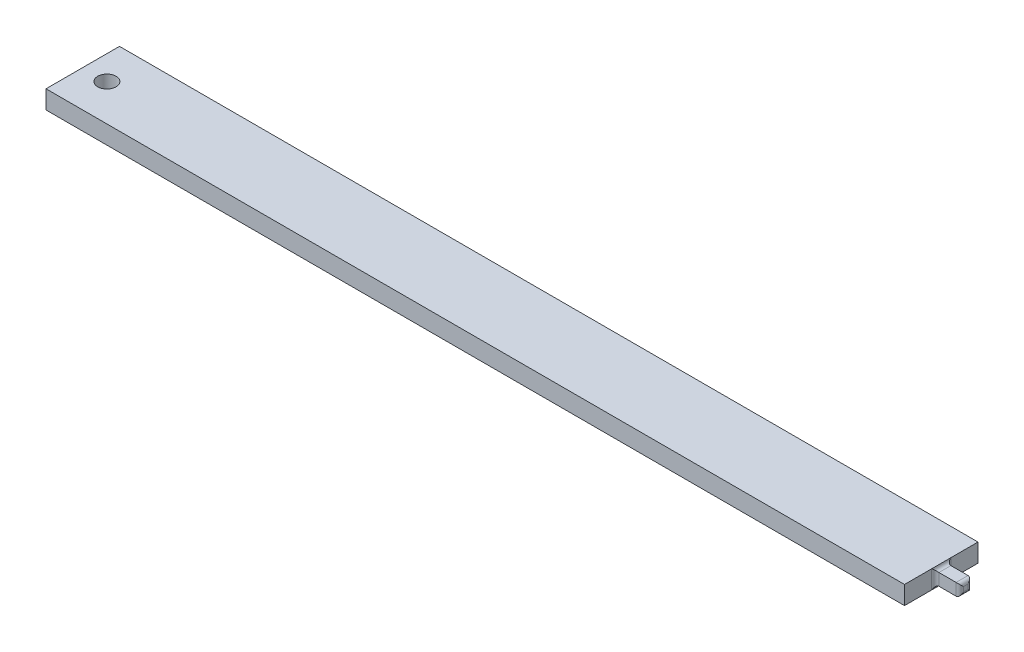
ISO-10303-21;
HEADER;
FILE_DESCRIPTION(('STEP AP214'),'2;1');
FILE_NAME('part.step','',(''),(''),'','','');
FILE_SCHEMA(('AUTOMOTIVE_DESIGN { 1 0 10303 214 1 1 1 1 }'));
ENDSEC;
DATA;
#1=APPLICATION_CONTEXT('core data for automotive mechanical design processes');
#2=APPLICATION_PROTOCOL_DEFINITION('international standard','automotive_design',2000,#1);
#3=PRODUCT_CONTEXT('',#1,'mechanical');
#4=PRODUCT('Part','Part','',(#3));
#5=PRODUCT_RELATED_PRODUCT_CATEGORY('part','',(#4));
#6=PRODUCT_DEFINITION_FORMATION('','',#4);
#7=PRODUCT_DEFINITION_CONTEXT('part definition',#1,'design');
#8=PRODUCT_DEFINITION('design','',#6,#7);
#9=PRODUCT_DEFINITION_SHAPE('','',#8);
#10=(LENGTH_UNIT() NAMED_UNIT(*) SI_UNIT(.MILLI.,.METRE.));
#11=(NAMED_UNIT(*) PLANE_ANGLE_UNIT() SI_UNIT($,.RADIAN.));
#12=(NAMED_UNIT(*) SI_UNIT($,.STERADIAN.) SOLID_ANGLE_UNIT());
#13=UNCERTAINTY_MEASURE_WITH_UNIT(LENGTH_MEASURE(1.E-05),#10,'distance_accuracy_value','');
#14=(GEOMETRIC_REPRESENTATION_CONTEXT(3) GLOBAL_UNCERTAINTY_ASSIGNED_CONTEXT((#13)) GLOBAL_UNIT_ASSIGNED_CONTEXT((#10,
#11,#12)) REPRESENTATION_CONTEXT('',''));
#15=CARTESIAN_POINT('',(0.,0.,0.));
#16=DIRECTION('',(0.,0.,1.));
#17=DIRECTION('',(1.,0.,0.));
#18=AXIS2_PLACEMENT_3D('',#15,#16,#17);
#19=CARTESIAN_POINT('',(0.,0.,6.));
#20=DIRECTION('',(-1.,0.,0.));
#21=DIRECTION('',(0.,0.,1.));
#22=AXIS2_PLACEMENT_3D('',#19,#20,#21);
#23=PLANE('',#22);
#24=DIRECTION('',(0.,0.,1.));
#25=VECTOR('',#24,1.);
#26=CARTESIAN_POINT('',(0.,3.,6.));
#27=LINE('',#26,#25);
#28=CARTESIAN_POINT('',(0.,3.,-6.));
#29=VERTEX_POINT('',#28);
#30=CARTESIAN_POINT('',(0.,3.,-1.575));
#31=VERTEX_POINT('',#30);
#32=EDGE_CURVE('E446',#29,#31,#27,.T.);
#33=ORIENTED_EDGE('',*,*,#32,.T.);
#34=DIRECTION('',(0.,1.,0.));
#35=VECTOR('',#34,1.);
#36=CARTESIAN_POINT('',(0.,0.525,-1.575));
#37=LINE('',#36,#35);
#38=CARTESIAN_POINT('',(0.,0.,-1.575));
#39=VERTEX_POINT('',#38);
#40=EDGE_CURVE('E164',#31,#39,#37,.F.);
#41=ORIENTED_EDGE('',*,*,#40,.T.);
#42=DIRECTION('',(0.,0.,1.));
#43=VECTOR('',#42,1.);
#44=CARTESIAN_POINT('',(0.,0.,6.));
#45=LINE('',#44,#43);
#46=CARTESIAN_POINT('',(0.,0.,-6.));
#47=VERTEX_POINT('',#46);
#48=EDGE_CURVE('E158',#47,#39,#45,.T.);
#49=ORIENTED_EDGE('',*,*,#48,.F.);
#50=DIRECTION('',(0.,1.,0.));
#51=VECTOR('',#50,1.);
#52=CARTESIAN_POINT('',(0.,0.,-6.));
#53=LINE('',#52,#51);
#54=EDGE_CURVE('E162',#47,#29,#53,.T.);
#55=ORIENTED_EDGE('',*,*,#54,.T.);
#56=EDGE_LOOP('',(#33,#41,#49,#55));
#57=FACE_BOUND('',#56,.T.);
#58=ADVANCED_FACE('F39',(#57),#23,.F.);
#59=CARTESIAN_POINT('',(0.,0.,1.575));
#60=VERTEX_POINT('',#59);
#61=CARTESIAN_POINT('',(0.,0.,6.));
#62=VERTEX_POINT('',#61);
#63=EDGE_CURVE('E175',#60,#62,#45,.T.);
#64=ORIENTED_EDGE('',*,*,#63,.F.);
#65=DIRECTION('',(0.,-1.,0.));
#66=VECTOR('',#65,1.);
#67=CARTESIAN_POINT('',(0.,2.475,1.575));
#68=LINE('',#67,#66);
#69=CARTESIAN_POINT('',(0.,3.,1.575));
#70=VERTEX_POINT('',#69);
#71=EDGE_CURVE('E229',#60,#70,#68,.F.);
#72=ORIENTED_EDGE('',*,*,#71,.T.);
#73=CARTESIAN_POINT('',(0.,3.,6.));
#74=VERTEX_POINT('',#73);
#75=EDGE_CURVE('E452',#70,#74,#27,.T.);
#76=ORIENTED_EDGE('',*,*,#75,.T.);
#77=DIRECTION('',(0.,1.,0.));
#78=VECTOR('',#77,1.);
#79=CARTESIAN_POINT('',(0.,0.,6.));
#80=LINE('',#79,#78);
#81=EDGE_CURVE('E169',#62,#74,#80,.T.);
#82=ORIENTED_EDGE('',*,*,#81,.F.);
#83=EDGE_LOOP('',(#64,#72,#76,#82));
#84=FACE_BOUND('',#83,.T.);
#85=ADVANCED_FACE('F263',(#84),#23,.F.);
#86=CARTESIAN_POINT('',(-140.2,3.,-6.));
#87=DIRECTION('',(0.,0.,1.));
#88=DIRECTION('',(1.,0.,0.));
#89=AXIS2_PLACEMENT_3D('',#86,#87,#88);
#90=PLANE('',#89);
#91=ORIENTED_EDGE('',*,*,#54,.F.);
#92=DIRECTION('',(-1.,0.,0.));
#93=VECTOR('',#92,1.);
#94=CARTESIAN_POINT('',(-140.2,0.,-6.));
#95=LINE('',#94,#93);
#96=CARTESIAN_POINT('',(-140.2,0.,-6.));
#97=VERTEX_POINT('',#96);
#98=EDGE_CURVE('E180',#47,#97,#95,.T.);
#99=ORIENTED_EDGE('',*,*,#98,.T.);
#100=DIRECTION('',(0.,-1.,0.));
#101=VECTOR('',#100,1.);
#102=CARTESIAN_POINT('',(-140.2,3.,-6.));
#103=LINE('',#102,#101);
#104=CARTESIAN_POINT('',(-140.2,3.,-6.));
#105=VERTEX_POINT('',#104);
#106=EDGE_CURVE('E201',#105,#97,#103,.T.);
#107=ORIENTED_EDGE('',*,*,#106,.F.);
#108=DIRECTION('',(-1.,0.,0.));
#109=VECTOR('',#108,1.);
#110=CARTESIAN_POINT('',(-140.2,3.,-6.));
#111=LINE('',#110,#109);
#112=EDGE_CURVE('E177',#29,#105,#111,.T.);
#113=ORIENTED_EDGE('',*,*,#112,.F.);
#114=EDGE_LOOP('',(#91,#99,#107,#113));
#115=FACE_BOUND('',#114,.T.);
#116=ADVANCED_FACE('F174',(#115),#90,.F.);
#117=CARTESIAN_POINT('',(0.,3.,0.));
#118=DIRECTION('',(0.,-1.,0.));
#119=DIRECTION('',(0.,0.,-1.));
#120=AXIS2_PLACEMENT_3D('',#117,#118,#119);
#121=PLANE('',#120);
#122=CARTESIAN_POINT('',(-136.25,3.,0.));
#123=DIRECTION('',(0.,1.,0.));
#124=DIRECTION('',(0.,0.,1.));
#125=AXIS2_PLACEMENT_3D('',#122,#123,#124);
#126=CIRCLE('',#125,1.5);
#127=CARTESIAN_POINT('',(-136.25,3.,1.5));
#128=VERTEX_POINT('',#127);
#129=EDGE_CURVE('E187',#128,#128,#126,.T.);
#130=ORIENTED_EDGE('',*,*,#129,.F.);
#131=EDGE_LOOP('',(#130));
#132=FACE_BOUND('',#131,.T.);
#133=ORIENTED_EDGE('',*,*,#32,.F.);
#134=ORIENTED_EDGE('',*,*,#112,.T.);
#135=DIRECTION('',(0.,0.,1.));
#136=VECTOR('',#135,1.);
#137=CARTESIAN_POINT('',(-140.2,3.,6.));
#138=LINE('',#137,#136);
#139=CARTESIAN_POINT('',(-140.2,3.,6.));
#140=VERTEX_POINT('',#139);
#141=EDGE_CURVE('E461',#105,#140,#138,.T.);
#142=ORIENTED_EDGE('',*,*,#141,.T.);
#143=DIRECTION('',(1.,0.,0.));
#144=VECTOR('',#143,1.);
#145=CARTESIAN_POINT('',(-140.2,3.,6.));
#146=LINE('',#145,#144);
#147=EDGE_CURVE('E195',#140,#74,#146,.T.);
#148=ORIENTED_EDGE('',*,*,#147,.T.);
#149=ORIENTED_EDGE('',*,*,#75,.F.);
#150=EDGE_CURVE('E453',#31,#70,#27,.T.);
#151=ORIENTED_EDGE('',*,*,#150,.F.);
#152=EDGE_LOOP('',(#133,#134,#142,#148,#149,#151));
#153=FACE_BOUND('',#152,.T.);
#154=ADVANCED_FACE('F275',(#132,#153),#121,.F.);
#155=CARTESIAN_POINT('',(0.,0.,0.));
#156=DIRECTION('',(0.,-1.,0.));
#157=DIRECTION('',(0.,0.,-1.));
#158=AXIS2_PLACEMENT_3D('',#155,#156,#157);
#159=PLANE('',#158);
#160=CARTESIAN_POINT('',(-136.25,0.,0.));
#161=DIRECTION('',(0.,1.,0.));
#162=DIRECTION('',(0.,0.,1.));
#163=AXIS2_PLACEMENT_3D('',#160,#161,#162);
#164=CIRCLE('',#163,1.5);
#165=CARTESIAN_POINT('',(-136.25,0.,1.5));
#166=VERTEX_POINT('',#165);
#167=EDGE_CURVE('E179',#166,#166,#164,.T.);
#168=ORIENTED_EDGE('',*,*,#167,.T.);
#169=EDGE_LOOP('',(#168));
#170=FACE_BOUND('',#169,.T.);
#171=ORIENTED_EDGE('',*,*,#98,.F.);
#172=ORIENTED_EDGE('',*,*,#48,.T.);
#173=EDGE_CURVE('E167',#39,#60,#45,.T.);
#174=ORIENTED_EDGE('',*,*,#173,.T.);
#175=ORIENTED_EDGE('',*,*,#63,.T.);
#176=DIRECTION('',(1.,0.,0.));
#177=VECTOR('',#176,1.);
#178=CARTESIAN_POINT('',(-140.2,0.,6.));
#179=LINE('',#178,#177);
#180=CARTESIAN_POINT('',(-140.2,0.,6.));
#181=VERTEX_POINT('',#180);
#182=EDGE_CURVE('E189',#181,#62,#179,.T.);
#183=ORIENTED_EDGE('',*,*,#182,.F.);
#184=DIRECTION('',(0.,0.,1.));
#185=VECTOR('',#184,1.);
#186=CARTESIAN_POINT('',(-140.2,0.,6.));
#187=LINE('',#186,#185);
#188=EDGE_CURVE('E184',#97,#181,#187,.T.);
#189=ORIENTED_EDGE('',*,*,#188,.F.);
#190=EDGE_LOOP('',(#171,#172,#174,#175,#183,#189));
#191=FACE_BOUND('',#190,.T.);
#192=ADVANCED_FACE('F182',(#170,#191),#159,.T.);
#193=CARTESIAN_POINT('',(-140.2,3.,6.));
#194=DIRECTION('',(1.,0.,0.));
#195=DIRECTION('',(0.,0.,-1.));
#196=AXIS2_PLACEMENT_3D('',#193,#194,#195);
#197=PLANE('',#196);
#198=ORIENTED_EDGE('',*,*,#188,.T.);
#199=DIRECTION('',(0.,-1.,0.));
#200=VECTOR('',#199,1.);
#201=CARTESIAN_POINT('',(-140.2,3.,6.));
#202=LINE('',#201,#200);
#203=EDGE_CURVE('E200',#140,#181,#202,.T.);
#204=ORIENTED_EDGE('',*,*,#203,.F.);
#205=ORIENTED_EDGE('',*,*,#141,.F.);
#206=ORIENTED_EDGE('',*,*,#106,.T.);
#207=EDGE_LOOP('',(#198,#204,#205,#206));
#208=FACE_BOUND('',#207,.T.);
#209=ADVANCED_FACE('F280',(#208),#197,.F.);
#210=CARTESIAN_POINT('',(-140.2,3.,6.));
#211=DIRECTION('',(0.,0.,-1.));
#212=DIRECTION('',(-1.,0.,0.));
#213=AXIS2_PLACEMENT_3D('',#210,#211,#212);
#214=PLANE('',#213);
#215=ORIENTED_EDGE('',*,*,#182,.T.);
#216=ORIENTED_EDGE('',*,*,#81,.T.);
#217=ORIENTED_EDGE('',*,*,#147,.F.);
#218=ORIENTED_EDGE('',*,*,#203,.T.);
#219=EDGE_LOOP('',(#215,#216,#217,#218));
#220=FACE_BOUND('',#219,.T.);
#221=ADVANCED_FACE('F270',(#220),#214,.F.);
#222=CARTESIAN_POINT('',(-136.25,0.,0.));
#223=DIRECTION('',(0.,1.,0.));
#224=DIRECTION('',(0.,0.,1.));
#225=AXIS2_PLACEMENT_3D('',#222,#223,#224);
#226=CYLINDRICAL_SURFACE('',#225,1.5);
#227=ORIENTED_EDGE('',*,*,#167,.F.);
#228=EDGE_LOOP('',(#227));
#229=FACE_BOUND('',#228,.T.);
#230=ORIENTED_EDGE('',*,*,#129,.T.);
#231=EDGE_LOOP('',(#230));
#232=FACE_BOUND('',#231,.T.);
#233=ADVANCED_FACE('F261',(#229,#232),#226,.F.);
#234=CARTESIAN_POINT('',(4.,0.525,-0.975));
#235=DIRECTION('',(0.,0.,1.));
#236=DIRECTION('',(1.,0.,0.));
#237=AXIS2_PLACEMENT_3D('',#234,#235,#236);
#238=PLANE('',#237);
#239=DIRECTION('',(-1.,0.,0.));
#240=VECTOR('',#239,1.);
#241=CARTESIAN_POINT('',(4.,2.475,-0.975));
#242=LINE('',#241,#240);
#243=CARTESIAN_POINT('',(3.4,2.475,-0.975));
#244=VERTEX_POINT('',#243);
#245=CARTESIAN_POINT('',(0.600000000000028,2.475,-0.975));
#246=VERTEX_POINT('',#245);
#247=EDGE_CURVE('E451',#244,#246,#242,.T.);
#248=ORIENTED_EDGE('',*,*,#247,.F.);
#249=DIRECTION('',(0.,1.,0.));
#250=VECTOR('',#249,1.);
#251=CARTESIAN_POINT('',(3.4,0.525,-0.975));
#252=LINE('',#251,#250);
#253=CARTESIAN_POINT('',(3.4,0.525,-0.975));
#254=VERTEX_POINT('',#253);
#255=EDGE_CURVE('E226',#244,#254,#252,.F.);
#256=ORIENTED_EDGE('',*,*,#255,.T.);
#257=DIRECTION('',(-1.,0.,0.));
#258=VECTOR('',#257,1.);
#259=CARTESIAN_POINT('',(4.,0.525,-0.975));
#260=LINE('',#259,#258);
#261=CARTESIAN_POINT('',(0.600000000000028,0.525,-0.975));
#262=VERTEX_POINT('',#261);
#263=EDGE_CURVE('E480',#254,#262,#260,.T.);
#264=ORIENTED_EDGE('',*,*,#263,.T.);
#265=DIRECTION('',(0.,1.,0.));
#266=VECTOR('',#265,1.);
#267=CARTESIAN_POINT('',(0.600000000000028,2.475,-0.975));
#268=LINE('',#267,#266);
#269=EDGE_CURVE('E225',#262,#246,#268,.T.);
#270=ORIENTED_EDGE('',*,*,#269,.T.);
#271=EDGE_LOOP('',(#248,#256,#264,#270));
#272=FACE_BOUND('',#271,.T.);
#273=ADVANCED_FACE('F256',(#272),#238,.F.);
#274=CARTESIAN_POINT('',(4.,2.475,0.975));
#275=DIRECTION('',(0.,-1.,0.));
#276=DIRECTION('',(0.,0.,-1.));
#277=AXIS2_PLACEMENT_3D('',#274,#275,#276);
#278=PLANE('',#277);
#279=DIRECTION('',(-1.,0.,0.));
#280=VECTOR('',#279,1.);
#281=CARTESIAN_POINT('',(4.,2.475,0.975));
#282=LINE('',#281,#280);
#283=CARTESIAN_POINT('',(3.4,2.475,0.975));
#284=VERTEX_POINT('',#283);
#285=CARTESIAN_POINT('',(0.600000000000028,2.475,0.975));
#286=VERTEX_POINT('',#285);
#287=EDGE_CURVE('E471',#284,#286,#282,.T.);
#288=ORIENTED_EDGE('',*,*,#287,.F.);
#289=DIRECTION('',(0.,0.,1.));
#290=VECTOR('',#289,1.);
#291=CARTESIAN_POINT('',(3.4,2.475,0.975));
#292=LINE('',#291,#290);
#293=EDGE_CURVE('E224',#284,#244,#292,.F.);
#294=ORIENTED_EDGE('',*,*,#293,.T.);
#295=ORIENTED_EDGE('',*,*,#247,.T.);
#296=CARTESIAN_POINT('',(0.600000000000028,2.475,-1.575));
#297=DIRECTION('',(0.,-1.,0.));
#298=DIRECTION('',(0.,0.,-1.));
#299=AXIS2_PLACEMENT_3D('',#296,#297,#298);
#300=CIRCLE('',#299,0.6);
#301=CARTESIAN_POINT('',(0.595294044989561,2.475,-0.975018455294299));
#302=VERTEX_POINT('',#301);
#303=EDGE_CURVE('E231',#246,#302,#300,.T.);
#304=ORIENTED_EDGE('',*,*,#303,.T.);
#305=CARTESIAN_POINT('',(0.59529404498956,2.475,-0.975018455294299));
#306=CARTESIAN_POINT('',(0.59529404498956,2.475,-0.975));
#307=B_SPLINE_CURVE_WITH_KNOTS('',1,(#305,#306),.UNSPECIFIED.,.F.,.F.,(2,2),(0.,1.),.UNSPECIFIED.);
#308=CARTESIAN_POINT('',(0.59529404498956,2.475,-0.975));
#309=VERTEX_POINT('',#308);
#310=EDGE_CURVE('E243',#302,#309,#307,.T.);
#311=ORIENTED_EDGE('',*,*,#310,.T.);
#312=DIRECTION('',(0.,0.,1.));
#313=VECTOR('',#312,1.);
#314=CARTESIAN_POINT('',(0.59529404498956,2.475,0.975));
#315=LINE('',#314,#313);
#316=CARTESIAN_POINT('',(0.59529404498956,2.475,0.975));
#317=VERTEX_POINT('',#316);
#318=EDGE_CURVE('E221',#309,#317,#315,.T.);
#319=ORIENTED_EDGE('',*,*,#318,.T.);
#320=CARTESIAN_POINT('',(0.59529404498956,2.475,0.975));
#321=CARTESIAN_POINT('',(0.59529404498956,2.475,0.975018455294299));
#322=B_SPLINE_CURVE_WITH_KNOTS('',1,(#320,#321),.UNSPECIFIED.,.F.,.F.,(2,2),(0.,1.),.UNSPECIFIED.);
#323=CARTESIAN_POINT('',(0.595294044989561,2.475,0.975018455294299));
#324=VERTEX_POINT('',#323);
#325=EDGE_CURVE('E64',#317,#324,#322,.T.);
#326=ORIENTED_EDGE('',*,*,#325,.T.);
#327=CARTESIAN_POINT('',(0.600000000000028,2.475,1.575));
#328=DIRECTION('',(0.,-1.,0.));
#329=DIRECTION('',(0.,0.,-1.));
#330=AXIS2_PLACEMENT_3D('',#327,#328,#329);
#331=CIRCLE('',#330,0.6);
#332=EDGE_CURVE('E238',#324,#286,#331,.T.);
#333=ORIENTED_EDGE('',*,*,#332,.T.);
#334=EDGE_LOOP('',(#288,#294,#295,#304,#311,#319,#326,#333));
#335=FACE_BOUND('',#334,.T.);
#336=ADVANCED_FACE('F246',(#335),#278,.F.);
#337=CARTESIAN_POINT('',(4.,0.525,0.975));
#338=DIRECTION('',(0.,0.,-1.));
#339=DIRECTION('',(-1.,0.,0.));
#340=AXIS2_PLACEMENT_3D('',#337,#338,#339);
#341=PLANE('',#340);
#342=DIRECTION('',(-1.,0.,0.));
#343=VECTOR('',#342,1.);
#344=CARTESIAN_POINT('',(4.,0.525,0.975));
#345=LINE('',#344,#343);
#346=CARTESIAN_POINT('',(3.4,0.525,0.975));
#347=VERTEX_POINT('',#346);
#348=CARTESIAN_POINT('',(0.600000000000028,0.525,0.975));
#349=VERTEX_POINT('',#348);
#350=EDGE_CURVE('E472',#347,#349,#345,.T.);
#351=ORIENTED_EDGE('',*,*,#350,.F.);
#352=DIRECTION('',(0.,-1.,0.));
#353=VECTOR('',#352,1.);
#354=CARTESIAN_POINT('',(3.4,0.525,0.975));
#355=LINE('',#354,#353);
#356=EDGE_CURVE('E218',#347,#284,#355,.F.);
#357=ORIENTED_EDGE('',*,*,#356,.T.);
#358=ORIENTED_EDGE('',*,*,#287,.T.);
#359=DIRECTION('',(0.,-1.,0.));
#360=VECTOR('',#359,1.);
#361=CARTESIAN_POINT('',(0.600000000000028,0.525,0.975));
#362=LINE('',#361,#360);
#363=EDGE_CURVE('E216',#286,#349,#362,.T.);
#364=ORIENTED_EDGE('',*,*,#363,.T.);
#365=EDGE_LOOP('',(#351,#357,#358,#364));
#366=FACE_BOUND('',#365,.T.);
#367=ADVANCED_FACE('F259',(#366),#341,.F.);
#368=CARTESIAN_POINT('',(4.,0.525,0.975));
#369=DIRECTION('',(0.,1.,0.));
#370=DIRECTION('',(0.,0.,1.));
#371=AXIS2_PLACEMENT_3D('',#368,#369,#370);
#372=PLANE('',#371);
#373=ORIENTED_EDGE('',*,*,#263,.F.);
#374=DIRECTION('',(0.,0.,-1.));
#375=VECTOR('',#374,1.);
#376=CARTESIAN_POINT('',(3.4,0.525,0.975));
#377=LINE('',#376,#375);
#378=EDGE_CURVE('E213',#254,#347,#377,.F.);
#379=ORIENTED_EDGE('',*,*,#378,.T.);
#380=ORIENTED_EDGE('',*,*,#350,.T.);
#381=CARTESIAN_POINT('',(0.600000000000028,0.525,1.575));
#382=DIRECTION('',(0.,1.,0.));
#383=DIRECTION('',(0.,0.,1.));
#384=AXIS2_PLACEMENT_3D('',#381,#382,#383);
#385=CIRCLE('',#384,0.6);
#386=CARTESIAN_POINT('',(0.595294044989561,0.525,0.975018455294299));
#387=VERTEX_POINT('',#386);
#388=EDGE_CURVE('E70',#349,#387,#385,.T.);
#389=ORIENTED_EDGE('',*,*,#388,.T.);
#390=CARTESIAN_POINT('',(0.59529404498956,0.525,0.975018455294299));
#391=CARTESIAN_POINT('',(0.59529404498956,0.525,0.975));
#392=B_SPLINE_CURVE_WITH_KNOTS('',1,(#390,#391),.UNSPECIFIED.,.F.,.F.,(2,2),(0.,1.),.UNSPECIFIED.);
#393=CARTESIAN_POINT('',(0.59529404498956,0.525,0.975));
#394=VERTEX_POINT('',#393);
#395=EDGE_CURVE('E11',#387,#394,#392,.T.);
#396=ORIENTED_EDGE('',*,*,#395,.T.);
#397=DIRECTION('',(0.,0.,1.));
#398=VECTOR('',#397,1.);
#399=CARTESIAN_POINT('',(0.59529404498956,0.525,0.975));
#400=LINE('',#399,#398);
#401=CARTESIAN_POINT('',(0.59529404498956,0.525,-0.975));
#402=VERTEX_POINT('',#401);
#403=EDGE_CURVE('E211',#394,#402,#400,.F.);
#404=ORIENTED_EDGE('',*,*,#403,.T.);
#405=CARTESIAN_POINT('',(0.59529404498956,0.525,-0.975));
#406=CARTESIAN_POINT('',(0.59529404498956,0.525,-0.975018455294299));
#407=B_SPLINE_CURVE_WITH_KNOTS('',1,(#405,#406),.UNSPECIFIED.,.F.,.F.,(2,2),(0.,1.),.UNSPECIFIED.);
#408=CARTESIAN_POINT('',(0.595294044989561,0.525,-0.975018455294299));
#409=VERTEX_POINT('',#408);
#410=EDGE_CURVE('E52',#402,#409,#407,.T.);
#411=ORIENTED_EDGE('',*,*,#410,.T.);
#412=CARTESIAN_POINT('',(0.600000000000028,0.525,-1.575));
#413=DIRECTION('',(0.,1.,0.));
#414=DIRECTION('',(0.,0.,1.));
#415=AXIS2_PLACEMENT_3D('',#412,#413,#414);
#416=CIRCLE('',#415,0.6);
#417=EDGE_CURVE('E232',#409,#262,#416,.T.);
#418=ORIENTED_EDGE('',*,*,#417,.T.);
#419=EDGE_LOOP('',(#373,#379,#380,#389,#396,#404,#411,#418));
#420=FACE_BOUND('',#419,.T.);
#421=ADVANCED_FACE('F379',(#420),#372,.F.);
#422=CARTESIAN_POINT('',(4.,0.,0.));
#423=DIRECTION('',(-1.,0.,0.));
#424=DIRECTION('',(0.,0.,1.));
#425=AXIS2_PLACEMENT_3D('',#422,#423,#424);
#426=PLANE('',#425);
#427=DIRECTION('',(0.,-1.,0.));
#428=VECTOR('',#427,1.);
#429=CARTESIAN_POINT('',(4.,0.,0.375));
#430=LINE('',#429,#428);
#431=CARTESIAN_POINT('',(4.,1.875,0.375));
#432=VERTEX_POINT('',#431);
#433=CARTESIAN_POINT('',(4.,1.125,0.375));
#434=VERTEX_POINT('',#433);
#435=EDGE_CURVE('E210',#432,#434,#430,.T.);
#436=ORIENTED_EDGE('',*,*,#435,.T.);
#437=DIRECTION('',(0.,0.,-1.));
#438=VECTOR('',#437,1.);
#439=CARTESIAN_POINT('',(4.,1.125,0.));
#440=LINE('',#439,#438);
#441=CARTESIAN_POINT('',(4.,1.125,-0.375));
#442=VERTEX_POINT('',#441);
#443=EDGE_CURVE('E209',#434,#442,#440,.T.);
#444=ORIENTED_EDGE('',*,*,#443,.T.);
#445=DIRECTION('',(0.,1.,0.));
#446=VECTOR('',#445,1.);
#447=CARTESIAN_POINT('',(4.,0.,-0.375));
#448=LINE('',#447,#446);
#449=CARTESIAN_POINT('',(4.,1.875,-0.375));
#450=VERTEX_POINT('',#449);
#451=EDGE_CURVE('E204',#442,#450,#448,.T.);
#452=ORIENTED_EDGE('',*,*,#451,.T.);
#453=DIRECTION('',(0.,0.,1.));
#454=VECTOR('',#453,1.);
#455=CARTESIAN_POINT('',(4.,1.875,0.));
#456=LINE('',#455,#454);
#457=EDGE_CURVE('E205',#450,#432,#456,.T.);
#458=ORIENTED_EDGE('',*,*,#457,.T.);
#459=EDGE_LOOP('',(#436,#444,#452,#458));
#460=FACE_BOUND('',#459,.T.);
#461=ADVANCED_FACE('F303',(#460),#426,.F.);
#462=CARTESIAN_POINT('',(3.4,1.875,0.));
#463=DIRECTION('',(0.,0.,1.));
#464=DIRECTION('',(1.,0.,0.));
#465=AXIS2_PLACEMENT_3D('',#462,#463,#464);
#466=CYLINDRICAL_SURFACE('',#465,0.6);
#467=CARTESIAN_POINT('',(3.4,1.875,-0.375));
#468=DIRECTION('',(0.,0.707106781186547,0.707106781186547));
#469=DIRECTION('',(0.,0.707106781186547,-0.707106781186547));
#470=AXIS2_PLACEMENT_3D('',#467,#468,#469);
#471=ELLIPSE('',#470,0.848528137423857,0.6);
#472=EDGE_CURVE('E485',#244,#450,#471,.F.);
#473=ORIENTED_EDGE('',*,*,#472,.F.);
#474=ORIENTED_EDGE('',*,*,#293,.F.);
#475=CARTESIAN_POINT('',(3.4,1.875,0.375));
#476=DIRECTION('',(0.,-0.707106781186547,0.707106781186547));
#477=DIRECTION('',(0.,0.707106781186547,0.707106781186547));
#478=AXIS2_PLACEMENT_3D('',#475,#476,#477);
#479=ELLIPSE('',#478,0.848528137423857,0.6);
#480=EDGE_CURVE('E482',#432,#284,#479,.T.);
#481=ORIENTED_EDGE('',*,*,#480,.F.);
#482=ORIENTED_EDGE('',*,*,#457,.F.);
#483=EDGE_LOOP('',(#473,#474,#481,#482));
#484=FACE_BOUND('',#483,.T.);
#485=ADVANCED_FACE('F299',(#484),#466,.T.);
#486=CARTESIAN_POINT('',(3.4,0.,0.375));
#487=DIRECTION('',(0.,-1.,0.));
#488=DIRECTION('',(0.,0.,-1.));
#489=AXIS2_PLACEMENT_3D('',#486,#487,#488);
#490=CYLINDRICAL_SURFACE('',#489,0.6);
#491=ORIENTED_EDGE('',*,*,#480,.T.);
#492=ORIENTED_EDGE('',*,*,#356,.F.);
#493=CARTESIAN_POINT('',(3.4,1.125,0.375));
#494=DIRECTION('',(0.,-0.707106781186547,-0.707106781186548));
#495=DIRECTION('',(0.,-0.707106781186548,0.707106781186547));
#496=AXIS2_PLACEMENT_3D('',#493,#494,#495);
#497=ELLIPSE('',#496,0.848528137423857,0.6);
#498=EDGE_CURVE('E489',#434,#347,#497,.T.);
#499=ORIENTED_EDGE('',*,*,#498,.F.);
#500=ORIENTED_EDGE('',*,*,#435,.F.);
#501=EDGE_LOOP('',(#491,#492,#499,#500));
#502=FACE_BOUND('',#501,.T.);
#503=ADVANCED_FACE('F294',(#502),#490,.T.);
#504=CARTESIAN_POINT('',(3.4,0.,-0.375));
#505=DIRECTION('',(0.,1.,0.));
#506=DIRECTION('',(0.,0.,1.));
#507=AXIS2_PLACEMENT_3D('',#504,#505,#506);
#508=CYLINDRICAL_SURFACE('',#507,0.6);
#509=ORIENTED_EDGE('',*,*,#472,.T.);
#510=ORIENTED_EDGE('',*,*,#451,.F.);
#511=CARTESIAN_POINT('',(3.4,1.125,-0.375));
#512=DIRECTION('',(0.,0.707106781186548,-0.707106781186547));
#513=DIRECTION('',(0.,0.707106781186547,0.707106781186548));
#514=AXIS2_PLACEMENT_3D('',#511,#512,#513);
#515=ELLIPSE('',#514,0.848528137423857,0.6);
#516=EDGE_CURVE('E494',#254,#442,#515,.F.);
#517=ORIENTED_EDGE('',*,*,#516,.F.);
#518=ORIENTED_EDGE('',*,*,#255,.F.);
#519=EDGE_LOOP('',(#509,#510,#517,#518));
#520=FACE_BOUND('',#519,.T.);
#521=ADVANCED_FACE('F293',(#520),#508,.T.);
#522=CARTESIAN_POINT('',(3.4,1.125,0.));
#523=DIRECTION('',(0.,0.,-1.));
#524=DIRECTION('',(0.,1.,0.));
#525=AXIS2_PLACEMENT_3D('',#522,#523,#524);
#526=CYLINDRICAL_SURFACE('',#525,0.6);
#527=ORIENTED_EDGE('',*,*,#498,.T.);
#528=ORIENTED_EDGE('',*,*,#378,.F.);
#529=ORIENTED_EDGE('',*,*,#516,.T.);
#530=ORIENTED_EDGE('',*,*,#443,.F.);
#531=EDGE_LOOP('',(#527,#528,#529,#530));
#532=FACE_BOUND('',#531,.T.);
#533=ADVANCED_FACE('F289',(#532),#526,.T.);
#534=CARTESIAN_POINT('',(0.600000000000028,0.525,1.575));
#535=DIRECTION('',(0.,1.,0.));
#536=DIRECTION('',(0.,0.,1.));
#537=AXIS2_PLACEMENT_3D('',#534,#535,#536);
#538=CYLINDRICAL_SURFACE('',#537,0.6);
#539=CARTESIAN_POINT('',(0.,3.,1.575));
#540=CARTESIAN_POINT('',(-1.93688459631018E-06,3.00003047855812,1.56968212119763));
#541=CARTESIAN_POINT('',(7.0393122550972E-05,2.99943979313663,1.56441821844699));
#542=CARTESIAN_POINT('',(0.000339915316153377,2.99733873332517,1.55420306668855));
#543=CARTESIAN_POINT('',(0.000534087667668493,2.99585063489771,1.5492473547657));
#544=CARTESIAN_POINT('',(0.0013166910190421,2.99011731292862,1.53387123435697));
#545=CARTESIAN_POINT('',(0.00209965635879181,2.98469452683893,1.52393414151246));
#546=CARTESIAN_POINT('',(0.00405689741959012,2.97263467830562,1.50466637355325));
#547=CARTESIAN_POINT('',(0.0052394142401021,2.96597349572063,1.49535388202537));
#548=CARTESIAN_POINT('',(0.00955106356673714,2.94410261691019,1.46650618166712));
#549=CARTESIAN_POINT('',(0.0133399203903435,2.92800165916371,1.44774512342325));
#550=CARTESIAN_POINT('',(0.0225483231535809,2.8953972137635,1.41097529015368));
#551=CARTESIAN_POINT('',(0.02797126285025,2.87889295470306,1.39296817046482));
#552=CARTESIAN_POINT('',(0.0404437185447096,2.84598641977892,1.35763810041595));
#553=CARTESIAN_POINT('',(0.0474828000062004,2.82958415472077,1.34031156208674));
#554=CARTESIAN_POINT('',(0.0632459207892726,2.79705770622538,1.30621243858734));
#555=CARTESIAN_POINT('',(0.0719685635653005,2.78093330428837,1.28943940768332));
#556=CARTESIAN_POINT('',(0.10091176054953,2.73296317568447,1.23975195979467));
#557=CARTESIAN_POINT('',(0.123821450882538,2.70175825111269,1.20771948807926));
#558=CARTESIAN_POINT('',(0.177375598665311,2.64264657069355,1.14719983593871));
#559=CARTESIAN_POINT('',(0.208005753764395,2.6147338547879,1.11870624377575));
#560=CARTESIAN_POINT('',(0.26363724449784,2.57432608555614,1.07746568345834));
#561=CARTESIAN_POINT('',(0.286071990986226,2.56010003767444,1.06294848861758));
#562=CARTESIAN_POINT('',(0.333845116834123,2.53427946255502,1.03657359858919));
#563=CARTESIAN_POINT('',(0.359179642027435,2.52268150201201,1.02471243383402));
#564=CARTESIAN_POINT('',(0.40845654530245,2.50431841307261,1.00587738777688));
#565=CARTESIAN_POINT('',(0.432048371876224,2.49709168760011,0.998439622226031));
#566=CARTESIAN_POINT('',(0.480624367988268,2.48553387687387,0.986466793741904));
#567=CARTESIAN_POINT('',(0.505605637866911,2.48119698952265,0.98192591534439));
#568=CARTESIAN_POINT('',(0.541566198592406,2.47731368241733,0.977755232426276));
#569=CARTESIAN_POINT('',(0.552272921984546,2.47644756190534,0.976804320751594));
#570=CARTESIAN_POINT('',(0.573748518490739,2.47529071879654,0.975478194660554));
#571=CARTESIAN_POINT('',(0.584517365109277,2.47499976680867,0.975102750747227));
#572=CARTESIAN_POINT('',(0.595294044989559,2.47499999999999,0.97501845529429));
#573=B_SPLINE_CURVE_WITH_KNOTS('',3,(#539,#540,#541,#542,#543,#544,#545,#546,#547,#548,#549,
#550,#551,#552,#553,#554,#555,#556,#557,#558,#559,#560,#561,#562,#563,#564,#565,#566,#567,#568,
#569,#570,#571,#572),.UNSPECIFIED.,.F.,.F.,(4,2,2,2,2,2,2,2,2,2,2,2,2,2,2,2,4),(0.,
0.0158358052225449,0.0312938365170304,0.0650697493313416,0.0995897948425401,0.174459048908188,
0.249484880178568,0.324039294005269,0.398532127302689,0.548574642000638,0.698341216325123,
0.788862142584996,0.879264122610287,0.956262036544787,1.03310488766456,1.06543016924437,
1.09774255612074),.UNSPECIFIED.);
#574=EDGE_CURVE('E321',#70,#324,#573,.T.);
#575=ORIENTED_EDGE('',*,*,#574,.F.);
#576=ORIENTED_EDGE('',*,*,#71,.F.);
#577=CARTESIAN_POINT('',(0.595294044989561,0.525,0.975018455294299));
#578=CARTESIAN_POINT('',(0.568296093739644,0.525045252974248,0.975184821087413));
#579=CARTESIAN_POINT('',(0.541383391579142,0.523181029719251,0.977260419618904));
#580=CARTESIAN_POINT('',(0.488738543793183,0.516041796835043,0.984824700426181));
#581=CARTESIAN_POINT('',(0.462998174910847,0.510796551118732,0.990283582891466));
#582=CARTESIAN_POINT('',(0.413281791324259,0.497309824825953,1.00420557145451));
#583=CARTESIAN_POINT('',(0.389301046794976,0.489076758842134,1.01266023896468));
#584=CARTESIAN_POINT('',(0.343388878565781,0.470125330359818,1.03206997523751));
#585=CARTESIAN_POINT('',(0.321462027069076,0.459401599598274,1.04303044407747));
#586=CARTESIAN_POINT('',(0.271328831287781,0.431144064575231,1.07188753019276));
#587=CARTESIAN_POINT('',(0.244253543302916,0.412624156105846,1.09078203158478));
#588=CARTESIAN_POINT('',(0.194677098660406,0.372796121477786,1.13143919564413));
#589=CARTESIAN_POINT('',(0.17218730817425,0.351481277053462,1.15320877014113));
#590=CARTESIAN_POINT('',(0.123784433515239,0.298392119222166,1.20756956028775));
#591=CARTESIAN_POINT('',(0.0998868517561265,0.265750269347212,1.2411003462576));
#592=CARTESIAN_POINT('',(0.0598848541398538,0.19859296627973,1.31063125667566));
#593=CARTESIAN_POINT('',(0.043769681315948,0.164080172999229,1.34662789369558));
#594=CARTESIAN_POINT('',(0.0270147817196289,0.117913527674657,1.39649380662078));
#595=CARTESIAN_POINT('',(0.0231777852269131,0.106193833117851,1.40930122756625));
#596=CARTESIAN_POINT('',(0.0163245057324809,0.0829248474925023,1.43533821378615));
#597=CARTESIAN_POINT('',(0.0133094859890543,0.071375844225259,1.44856839430936));
#598=CARTESIAN_POINT('',(0.00864782280971966,0.051217795475658,1.47290704495721));
#599=CARTESIAN_POINT('',(0.00684731524134696,0.0424921363840483,1.48389312404597));
#600=CARTESIAN_POINT('',(0.00379351808612983,0.0259672250129158,1.50665543236036));
#601=CARTESIAN_POINT('',(0.00253846967458301,0.0181650550762352,1.51842897854842));
#602=CARTESIAN_POINT('',(0.00125280250568322,0.00939132832751497,1.53594014145858));
#603=CARTESIAN_POINT('',(0.000941780541474773,0.00715185381414397,1.54099250071324));
#604=CARTESIAN_POINT('',(0.00044342494003467,0.00346103592863321,1.55136569872963));
#605=CARTESIAN_POINT('',(0.000255255842776013,0.00200438125177706,1.55668445344813));
#606=CARTESIAN_POINT('',(9.30702891983599E-05,0.000735941117496274,1.56421951274603));
#607=CARTESIAN_POINT('',(5.83953434220995E-05,0.000462435519970865,1.56635897509023));
#608=CARTESIAN_POINT('',(1.17626954599942E-05,9.33838556116656E-05,1.57066509802423));
#609=CARTESIAN_POINT('',(-6.97578394144218E-08,-1.18099599527324E-06,1.57283184336525));
#610=CARTESIAN_POINT('',(0.,0.,1.575));
#611=B_SPLINE_CURVE_WITH_KNOTS('',3,(#577,#578,#579,#580,#581,#582,#583,#584,#585,#586,#587,
#588,#589,#590,#591,#592,#593,#594,#595,#596,#597,#598,#599,#600,#601,#602,#603,#604,#605,#606,
#607,#608,#609,#610),.UNSPECIFIED.,.F.,.F.,(4,2,2,2,2,2,2,2,2,2,2,2,2,2,2,2,4),(0.,
0.0807556568447109,0.160809936354527,0.240640486902267,0.32064472399803,0.43358528098041,
0.546802471069156,0.703607637935905,0.860195441468553,0.913523080747445,0.966932220643697,
1.00937079841648,1.05167149961842,1.06823884116675,1.08469230951467,1.09115685708894,
1.09765675120037),.UNSPECIFIED.);
#612=EDGE_CURVE('E42',#387,#60,#611,.T.);
#613=ORIENTED_EDGE('',*,*,#612,.F.);
#614=ORIENTED_EDGE('',*,*,#388,.F.);
#615=ORIENTED_EDGE('',*,*,#363,.F.);
#616=ORIENTED_EDGE('',*,*,#332,.F.);
#617=EDGE_LOOP('',(#575,#576,#613,#614,#615,#616));
#618=FACE_BOUND('',#617,.T.);
#619=ADVANCED_FACE('F41',(#618),#538,.F.);
#620=CARTESIAN_POINT('',(0.595294044989561,-0.0750000000000004,6.));
#621=DIRECTION('',(0.,0.,1.));
#622=DIRECTION('',(1.,0.,0.));
#623=AXIS2_PLACEMENT_3D('',#620,#621,#622);
#624=CYLINDRICAL_SURFACE('',#623,0.6);
#625=ORIENTED_EDGE('',*,*,#612,.T.);
#626=ORIENTED_EDGE('',*,*,#173,.F.);
#627=CARTESIAN_POINT('',(0.,0.,-1.575));
#628=CARTESIAN_POINT('',(-1.93688459630334E-06,-3.0478558118052E-05,-1.56968212119763));
#629=CARTESIAN_POINT('',(7.03931225509789E-05,0.000560206863366666,-1.56441821844699));
#630=CARTESIAN_POINT('',(0.000339915316153381,0.00266126667482467,-1.55420306668855));
#631=CARTESIAN_POINT('',(0.000534087667668493,0.00414936510228707,-1.5492473547657));
#632=CARTESIAN_POINT('',(0.00131669101904209,0.00988268707138437,-1.53387123435697));
#633=CARTESIAN_POINT('',(0.00209965635879179,0.0153054731610727,-1.52393414151246));
#634=CARTESIAN_POINT('',(0.00405689741959007,0.0273653216943818,-1.50466637355325));
#635=CARTESIAN_POINT('',(0.00523941424010203,0.0340265042793661,-1.49535388202537));
#636=CARTESIAN_POINT('',(0.00955106356673702,0.0558973830898092,-1.46650618166713));
#637=CARTESIAN_POINT('',(0.0133399203903433,0.0719983408362846,-1.44774512342325));
#638=CARTESIAN_POINT('',(0.0225483231535806,0.104602786236495,-1.41097529015369));
#639=CARTESIAN_POINT('',(0.0279712628502496,0.121107045296942,-1.39296817046482));
#640=CARTESIAN_POINT('',(0.0404437185447089,0.154013580221075,-1.35763810041595));
#641=CARTESIAN_POINT('',(0.0474828000061996,0.17041584527923,-1.34031156208674));
#642=CARTESIAN_POINT('',(0.0632459207892715,0.202942293774618,-1.30621243858735));
#643=CARTESIAN_POINT('',(0.0719685635652993,0.219066695711629,-1.28943940768333));
#644=CARTESIAN_POINT('',(0.100911760549528,0.267036824315523,-1.23975195979467));
#645=CARTESIAN_POINT('',(0.123821450882536,0.298241748887311,-1.20771948807926));
#646=CARTESIAN_POINT('',(0.177375598665308,0.357353429306448,-1.14719983593871));
#647=CARTESIAN_POINT('',(0.208005753764392,0.3852661452121,-1.11870624377575));
#648=CARTESIAN_POINT('',(0.263637244497836,0.425673914443859,-1.07746568345834));
#649=CARTESIAN_POINT('',(0.286071990986221,0.439899962325552,-1.06294848861758));
#650=CARTESIAN_POINT('',(0.333845116834119,0.465720537444978,-1.03657359858919));
#651=CARTESIAN_POINT('',(0.35917964202743,0.477318497987992,-1.02471243383402));
#652=CARTESIAN_POINT('',(0.408456545302445,0.495681586927386,-1.00587738777688));
#653=CARTESIAN_POINT('',(0.432048371876219,0.502908312399884,-0.998439622226032));
#654=CARTESIAN_POINT('',(0.480624367988263,0.51446612312613,-0.986466793741905));
#655=CARTESIAN_POINT('',(0.505605637866906,0.518803010477346,-0.981925915344391));
#656=CARTESIAN_POINT('',(0.541566198592402,0.522686317582671,-0.977755232426276));
#657=CARTESIAN_POINT('',(0.552272921984543,0.523552438094657,-0.976804320751594));
#658=CARTESIAN_POINT('',(0.573748518490737,0.52470928120346,-0.975478194660554));
#659=CARTESIAN_POINT('',(0.584517365109276,0.525000233191329,-0.975102750747227));
#660=CARTESIAN_POINT('',(0.595294044989559,0.525000000000008,-0.97501845529429));
#661=B_SPLINE_CURVE_WITH_KNOTS('',3,(#627,#628,#629,#630,#631,#632,#633,#634,#635,#636,#637,
#638,#639,#640,#641,#642,#643,#644,#645,#646,#647,#648,#649,#650,#651,#652,#653,#654,#655,#656,
#657,#658,#659,#660),.UNSPECIFIED.,.F.,.F.,(4,2,2,2,2,2,2,2,2,2,2,2,2,2,2,2,4),(0.,
0.015835805222545,0.0312938365170305,0.0650697493313412,0.0995897948425389,0.174459048908186,
0.249484880178566,0.324039294005266,0.398532127302685,0.548574642000633,0.698341216325116,
0.788862142584991,0.879264122610282,0.956262036544783,1.03310488766455,1.06543016924436,
1.09774255612074),.UNSPECIFIED.);
#662=EDGE_CURVE('E330',#409,#39,#661,.F.);
#663=ORIENTED_EDGE('',*,*,#662,.F.);
#664=ORIENTED_EDGE('',*,*,#410,.F.);
#665=ORIENTED_EDGE('',*,*,#403,.F.);
#666=ORIENTED_EDGE('',*,*,#395,.F.);
#667=EDGE_LOOP('',(#625,#626,#663,#664,#665,#666));
#668=FACE_BOUND('',#667,.T.);
#669=ADVANCED_FACE('F309',(#668),#624,.F.);
#670=CARTESIAN_POINT('',(0.595294044989561,3.075,6.));
#671=DIRECTION('',(0.,0.,1.));
#672=DIRECTION('',(1.,0.,0.));
#673=AXIS2_PLACEMENT_3D('',#670,#671,#672);
#674=CYLINDRICAL_SURFACE('',#673,0.6);
#675=ORIENTED_EDGE('',*,*,#318,.F.);
#676=ORIENTED_EDGE('',*,*,#310,.F.);
#677=CARTESIAN_POINT('',(0.595294044989561,2.475,-0.975018455294299));
#678=CARTESIAN_POINT('',(0.568296093739645,2.47495474702575,-0.975184821087413));
#679=CARTESIAN_POINT('',(0.541383391579142,2.47681897028075,-0.977260419618904));
#680=CARTESIAN_POINT('',(0.488738543793183,2.48395820316496,-0.984824700426181));
#681=CARTESIAN_POINT('',(0.462998174910847,2.48920344888127,-0.990283582891466));
#682=CARTESIAN_POINT('',(0.413281791324259,2.50269017517405,-1.00420557145451));
#683=CARTESIAN_POINT('',(0.389301046794976,2.51092324115787,-1.01266023896468));
#684=CARTESIAN_POINT('',(0.343388878565782,2.52987466964018,-1.03206997523751));
#685=CARTESIAN_POINT('',(0.321462027069076,2.54059840040173,-1.04303044407747));
#686=CARTESIAN_POINT('',(0.271328831287781,2.56885593542477,-1.07188753019276));
#687=CARTESIAN_POINT('',(0.244253543302916,2.58737584389415,-1.09078203158478));
#688=CARTESIAN_POINT('',(0.194677098660406,2.62720387852221,-1.13143919564413));
#689=CARTESIAN_POINT('',(0.17218730817425,2.64851872294654,-1.15320877014113));
#690=CARTESIAN_POINT('',(0.123784433515239,2.70160788077783,-1.20756956028775));
#691=CARTESIAN_POINT('',(0.0998868517561262,2.73424973065279,-1.2411003462576));
#692=CARTESIAN_POINT('',(0.0598848541398536,2.80140703372027,-1.31063125667566));
#693=CARTESIAN_POINT('',(0.043769681315948,2.83591982700077,-1.34662789369558));
#694=CARTESIAN_POINT('',(0.0270147817196289,2.88208647232534,-1.39649380662078));
#695=CARTESIAN_POINT('',(0.0231777852269131,2.89380616688215,-1.40930122756625));
#696=CARTESIAN_POINT('',(0.016324505732481,2.9170751525075,-1.43533821378615));
#697=CARTESIAN_POINT('',(0.0133094859890544,2.92862415577474,-1.44856839430936));
#698=CARTESIAN_POINT('',(0.00864782280971963,2.94878220452434,-1.47290704495721));
#699=CARTESIAN_POINT('',(0.00684731524134682,2.95750786361595,-1.48389312404597));
#700=CARTESIAN_POINT('',(0.00379351808612959,2.97403277498708,-1.50665543236036));
#701=CARTESIAN_POINT('',(0.00253846967458277,2.98183494492377,-1.51842897854842));
#702=CARTESIAN_POINT('',(0.00125280250568315,2.99060867167249,-1.53594014145858));
#703=CARTESIAN_POINT('',(0.000941780541474761,2.99284814618586,-1.54099250071324));
#704=CARTESIAN_POINT('',(0.000443424940034755,2.99653896407137,-1.55136569872963));
#705=CARTESIAN_POINT('',(0.000255255842776127,2.99799561874822,-1.55668445344813));
#706=CARTESIAN_POINT('',(9.30702891984424E-05,2.9992640588825,-1.56421951274603));
#707=CARTESIAN_POINT('',(5.83953434221654E-05,2.99953756448003,-1.56635897509023));
#708=CARTESIAN_POINT('',(1.17626954600045E-05,2.99990661614439,-1.57066509802423));
#709=CARTESIAN_POINT('',(-6.97578394437388E-08,3.000001180996,-1.57283184336525));
#710=CARTESIAN_POINT('',(0.,3.,-1.575));
#711=B_SPLINE_CURVE_WITH_KNOTS('',3,(#677,#678,#679,#680,#681,#682,#683,#684,#685,#686,#687,
#688,#689,#690,#691,#692,#693,#694,#695,#696,#697,#698,#699,#700,#701,#702,#703,#704,#705,#706,
#707,#708,#709,#710),.UNSPECIFIED.,.F.,.F.,(4,2,2,2,2,2,2,2,2,2,2,2,2,2,2,2,4),(0.,
0.0807556568447108,0.160809936354527,0.240640486902266,0.32064472399803,0.43358528098041,
0.546802471069156,0.703607637935906,0.860195441468552,0.913523080747445,0.966932220643697,
1.00937079841649,1.05167149961842,1.06823884116675,1.08469230951467,1.09115685708894,
1.09765675120037),.UNSPECIFIED.);
#712=EDGE_CURVE('E314',#31,#302,#711,.F.);
#713=ORIENTED_EDGE('',*,*,#712,.F.);
#714=ORIENTED_EDGE('',*,*,#150,.T.);
#715=ORIENTED_EDGE('',*,*,#574,.T.);
#716=ORIENTED_EDGE('',*,*,#325,.F.);
#717=EDGE_LOOP('',(#675,#676,#713,#714,#715,#716));
#718=FACE_BOUND('',#717,.T.);
#719=ADVANCED_FACE('F304',(#718),#674,.F.);
#720=CARTESIAN_POINT('',(0.600000000000028,0.525,-1.575));
#721=DIRECTION('',(0.,-1.,0.));
#722=DIRECTION('',(0.,0.,-1.));
#723=AXIS2_PLACEMENT_3D('',#720,#721,#722);
#724=CYLINDRICAL_SURFACE('',#723,0.6);
#725=ORIENTED_EDGE('',*,*,#662,.T.);
#726=ORIENTED_EDGE('',*,*,#40,.F.);
#727=ORIENTED_EDGE('',*,*,#712,.T.);
#728=ORIENTED_EDGE('',*,*,#303,.F.);
#729=ORIENTED_EDGE('',*,*,#269,.F.);
#730=ORIENTED_EDGE('',*,*,#417,.F.);
#731=EDGE_LOOP('',(#725,#726,#727,#728,#729,#730));
#732=FACE_BOUND('',#731,.T.);
#733=ADVANCED_FACE('F307',(#732),#724,.F.);
#734=CLOSED_SHELL('',(#58,#85,#116,#154,#192,#209,#221,#233,#273,#336,#367,#421,#461,#485,#503,
#521,#533,#619,#669,#719,#733));
#735=MANIFOLD_SOLID_BREP('B2',#734);
#736=ADVANCED_BREP_SHAPE_REPRESENTATION('',(#18,#735),#14);
#737=SHAPE_DEFINITION_REPRESENTATION(#9,#736);
ENDSEC;
END-ISO-10303-21;
